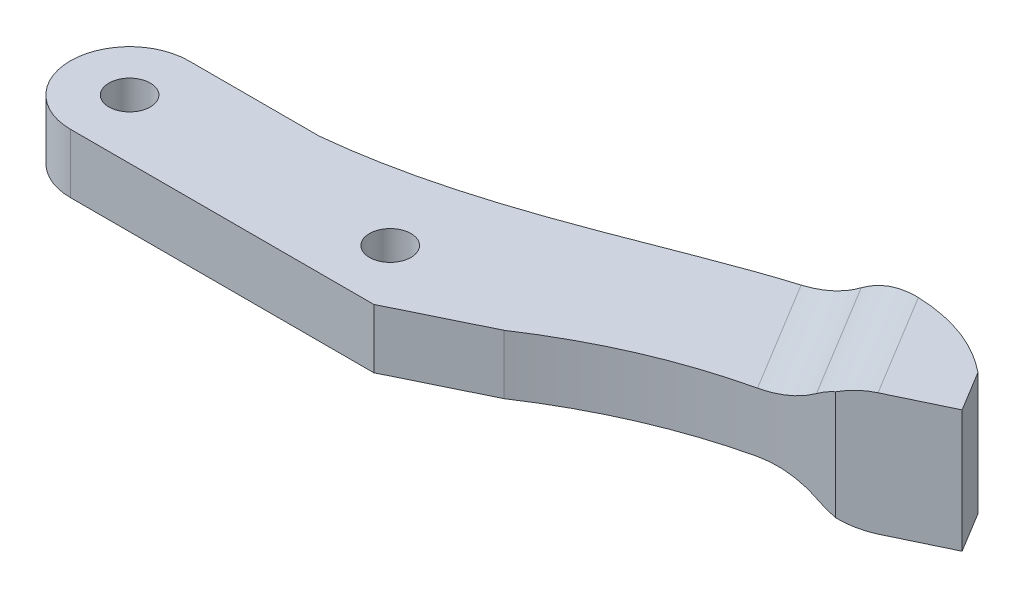
ISO-10303-21;
HEADER;
FILE_DESCRIPTION(('STEP AP214'),'2;1');
FILE_NAME('part.step','',(''),(''),'','','');
FILE_SCHEMA(('AUTOMOTIVE_DESIGN { 1 0 10303 214 1 1 1 1 }'));
ENDSEC;
DATA;
#1=APPLICATION_CONTEXT('core data for automotive mechanical design processes');
#2=APPLICATION_PROTOCOL_DEFINITION('international standard','automotive_design',2000,#1);
#3=PRODUCT_CONTEXT('',#1,'mechanical');
#4=PRODUCT('Part','Part','',(#3));
#5=PRODUCT_RELATED_PRODUCT_CATEGORY('part','',(#4));
#6=PRODUCT_DEFINITION_FORMATION('','',#4);
#7=PRODUCT_DEFINITION_CONTEXT('part definition',#1,'design');
#8=PRODUCT_DEFINITION('design','',#6,#7);
#9=PRODUCT_DEFINITION_SHAPE('','',#8);
#10=(LENGTH_UNIT() NAMED_UNIT(*) SI_UNIT(.MILLI.,.METRE.));
#11=(NAMED_UNIT(*) PLANE_ANGLE_UNIT() SI_UNIT($,.RADIAN.));
#12=(NAMED_UNIT(*) SI_UNIT($,.STERADIAN.) SOLID_ANGLE_UNIT());
#13=UNCERTAINTY_MEASURE_WITH_UNIT(LENGTH_MEASURE(1.E-05),#10,'distance_accuracy_value','');
#14=(GEOMETRIC_REPRESENTATION_CONTEXT(3) GLOBAL_UNCERTAINTY_ASSIGNED_CONTEXT((#13)) GLOBAL_UNIT_ASSIGNED_CONTEXT((#10,
#11,#12)) REPRESENTATION_CONTEXT('',''));
#15=CARTESIAN_POINT('',(0.,0.,0.));
#16=DIRECTION('',(0.,0.,1.));
#17=DIRECTION('',(1.,0.,0.));
#18=AXIS2_PLACEMENT_3D('',#15,#16,#17);
#19=CARTESIAN_POINT('',(-15.6092476783561,6.85945404184539,-4.88622521109503));
#20=DIRECTION('',(0.,0.,-1.));
#21=DIRECTION('',(-1.,0.,0.));
#22=AXIS2_PLACEMENT_3D('',#19,#20,#21);
#23=PLANE('',#22);
#24=DIRECTION('',(1.,0.,0.));
#25=VECTOR('',#24,1.);
#26=CARTESIAN_POINT('',(-15.6092476783561,6.85945404184539,-4.88622521109503));
#27=LINE('',#26,#25);
#28=CARTESIAN_POINT('',(-15.6092476783561,6.85945404184539,-4.88622521109503));
#29=VERTEX_POINT('',#28);
#30=CARTESIAN_POINT('',(0.890752321643914,6.85945404184539,-4.88622521109503));
#31=VERTEX_POINT('',#30);
#32=EDGE_CURVE('E364',#29,#31,#27,.T.);
#33=ORIENTED_EDGE('',*,*,#32,.T.);
#34=DIRECTION('',(0.,1.,0.));
#35=VECTOR('',#34,1.);
#36=CARTESIAN_POINT('',(0.890752321643914,-5.89054595815461,-4.88622521109503));
#37=LINE('',#36,#35);
#38=CARTESIAN_POINT('',(0.890752321643914,-0.640545958154606,-4.88622521109503));
#39=VERTEX_POINT('',#38);
#40=EDGE_CURVE('E390',#39,#31,#37,.T.);
#41=ORIENTED_EDGE('',*,*,#40,.F.);
#42=DIRECTION('',(1.,0.,0.));
#43=VECTOR('',#42,1.);
#44=CARTESIAN_POINT('',(-15.6092476783561,-0.640545958154606,-4.88622521109503));
#45=LINE('',#44,#43);
#46=CARTESIAN_POINT('',(-15.6092476783561,-0.640545958154606,-4.88622521109503));
#47=VERTEX_POINT('',#46);
#48=EDGE_CURVE('E346',#47,#39,#45,.T.);
#49=ORIENTED_EDGE('',*,*,#48,.F.);
#50=DIRECTION('',(0.,-1.,0.));
#51=VECTOR('',#50,1.);
#52=CARTESIAN_POINT('',(-15.6092476783561,6.85945404184539,-4.88622521109503));
#53=LINE('',#52,#51);
#54=EDGE_CURVE('E337',#29,#47,#53,.T.);
#55=ORIENTED_EDGE('',*,*,#54,.F.);
#56=EDGE_LOOP('',(#33,#41,#49,#55));
#57=FACE_BOUND('',#56,.T.);
#58=ADVANCED_FACE('F46',(#57),#23,.T.);
#59=CARTESIAN_POINT('',(-15.6092476783561,6.85945404184539,2.61377478890497));
#60=DIRECTION('',(0.,-1.,0.));
#61=DIRECTION('',(0.,0.,-1.));
#62=AXIS2_PLACEMENT_3D('',#59,#60,#61);
#63=CYLINDRICAL_SURFACE('',#62,7.5);
#64=CARTESIAN_POINT('',(-15.6092476783561,-0.640545958154606,2.61377478890497));
#65=DIRECTION('',(0.,1.,0.));
#66=DIRECTION('',(0.,0.,1.));
#67=AXIS2_PLACEMENT_3D('',#64,#65,#66);
#68=CIRCLE('',#67,7.5);
#69=CARTESIAN_POINT('',(-15.6092476783561,-0.640545958154606,10.113774788905));
#70=VERTEX_POINT('',#69);
#71=EDGE_CURVE('E353',#47,#70,#68,.T.);
#72=ORIENTED_EDGE('',*,*,#71,.T.);
#73=DIRECTION('',(0.,-1.,0.));
#74=VECTOR('',#73,1.);
#75=CARTESIAN_POINT('',(-15.6092476783561,6.85945404184539,10.113774788905));
#76=LINE('',#75,#74);
#77=CARTESIAN_POINT('',(-15.6092476783561,6.85945404184539,10.113774788905));
#78=VERTEX_POINT('',#77);
#79=EDGE_CURVE('E331',#78,#70,#76,.T.);
#80=ORIENTED_EDGE('',*,*,#79,.F.);
#81=CARTESIAN_POINT('',(-15.6092476783561,6.85945404184539,2.61377478890497));
#82=DIRECTION('',(0.,1.,0.));
#83=DIRECTION('',(0.,0.,1.));
#84=AXIS2_PLACEMENT_3D('',#81,#82,#83);
#85=CIRCLE('',#84,7.5);
#86=EDGE_CURVE('E372',#29,#78,#85,.T.);
#87=ORIENTED_EDGE('',*,*,#86,.F.);
#88=ORIENTED_EDGE('',*,*,#54,.T.);
#89=EDGE_LOOP('',(#72,#80,#87,#88));
#90=FACE_BOUND('',#89,.T.);
#91=ADVANCED_FACE('F452',(#90),#63,.T.);
#92=CARTESIAN_POINT('',(-15.6092476783561,6.85945404184539,10.113774788905));
#93=DIRECTION('',(0.,0.,-1.));
#94=DIRECTION('',(-1.,0.,0.));
#95=AXIS2_PLACEMENT_3D('',#92,#93,#94);
#96=PLANE('',#95);
#97=DIRECTION('',(1.,0.,0.));
#98=VECTOR('',#97,1.);
#99=CARTESIAN_POINT('',(-15.6092476783561,-0.640545958154606,10.113774788905));
#100=LINE('',#99,#98);
#101=CARTESIAN_POINT('',(22.8078104755404,-0.640545958154606,10.113774788905));
#102=VERTEX_POINT('',#101);
#103=EDGE_CURVE('E350',#70,#102,#100,.T.);
#104=ORIENTED_EDGE('',*,*,#103,.T.);
#105=DIRECTION('',(0.,1.,0.));
#106=VECTOR('',#105,1.);
#107=CARTESIAN_POINT('',(22.8078104755404,-5.89054595815461,10.113774788905));
#108=LINE('',#107,#106);
#109=CARTESIAN_POINT('',(22.8078104755404,6.85945404184539,10.113774788905));
#110=VERTEX_POINT('',#109);
#111=EDGE_CURVE('E387',#102,#110,#108,.T.);
#112=ORIENTED_EDGE('',*,*,#111,.T.);
#113=DIRECTION('',(1.,0.,0.));
#114=VECTOR('',#113,1.);
#115=CARTESIAN_POINT('',(-15.6092476783561,6.85945404184539,10.113774788905));
#116=LINE('',#115,#114);
#117=EDGE_CURVE('E368',#78,#110,#116,.T.);
#118=ORIENTED_EDGE('',*,*,#117,.F.);
#119=ORIENTED_EDGE('',*,*,#79,.T.);
#120=EDGE_LOOP('',(#104,#112,#118,#119));
#121=FACE_BOUND('',#120,.T.);
#122=ADVANCED_FACE('F454',(#121),#96,.F.);
#123=CARTESIAN_POINT('',(-15.6092476783561,6.85945404184539,2.61377478890497));
#124=DIRECTION('',(0.,-1.,0.));
#125=DIRECTION('',(0.,0.,-1.));
#126=AXIS2_PLACEMENT_3D('',#123,#124,#125);
#127=CYLINDRICAL_SURFACE('',#126,2.625);
#128=CARTESIAN_POINT('',(-15.6092476783561,6.85945404184539,2.61377478890497));
#129=DIRECTION('',(0.,1.,0.));
#130=DIRECTION('',(0.,0.,1.));
#131=AXIS2_PLACEMENT_3D('',#128,#129,#130);
#132=CIRCLE('',#131,2.625);
#133=CARTESIAN_POINT('',(-15.6092476783561,6.85945404184539,5.23877478890497));
#134=VERTEX_POINT('',#133);
#135=EDGE_CURVE('E345',#134,#134,#132,.T.);
#136=ORIENTED_EDGE('',*,*,#135,.T.);
#137=EDGE_LOOP('',(#136));
#138=FACE_BOUND('',#137,.T.);
#139=CARTESIAN_POINT('',(-15.6092476783561,-0.640545958154606,2.61377478890497));
#140=DIRECTION('',(0.,1.,0.));
#141=DIRECTION('',(0.,0.,1.));
#142=AXIS2_PLACEMENT_3D('',#139,#140,#141);
#143=CIRCLE('',#142,2.625);
#144=CARTESIAN_POINT('',(-15.6092476783561,-0.640545958154606,5.23877478890497));
#145=VERTEX_POINT('',#144);
#146=EDGE_CURVE('E357',#145,#145,#143,.T.);
#147=ORIENTED_EDGE('',*,*,#146,.F.);
#148=EDGE_LOOP('',(#147));
#149=FACE_BOUND('',#148,.T.);
#150=ADVANCED_FACE('F475',(#138,#149),#127,.F.);
#151=CARTESIAN_POINT('',(17.3907523216439,6.85945404184539,2.61377478890497));
#152=DIRECTION('',(0.,-1.,0.));
#153=DIRECTION('',(0.,0.,-1.));
#154=AXIS2_PLACEMENT_3D('',#151,#152,#153);
#155=CYLINDRICAL_SURFACE('',#154,2.625);
#156=CARTESIAN_POINT('',(17.3907523216439,6.85945404184539,2.61377478890497));
#157=DIRECTION('',(0.,1.,0.));
#158=DIRECTION('',(0.,0.,1.));
#159=AXIS2_PLACEMENT_3D('',#156,#157,#158);
#160=CIRCLE('',#159,2.625);
#161=CARTESIAN_POINT('',(17.3907523216439,6.85945404184539,5.23877478890497));
#162=VERTEX_POINT('',#161);
#163=EDGE_CURVE('E340',#162,#162,#160,.T.);
#164=ORIENTED_EDGE('',*,*,#163,.T.);
#165=EDGE_LOOP('',(#164));
#166=FACE_BOUND('',#165,.T.);
#167=CARTESIAN_POINT('',(17.3907523216439,-0.640545958154606,2.61377478890497));
#168=DIRECTION('',(0.,1.,0.));
#169=DIRECTION('',(0.,0.,1.));
#170=AXIS2_PLACEMENT_3D('',#167,#168,#169);
#171=CIRCLE('',#170,2.625);
#172=CARTESIAN_POINT('',(17.3907523216439,-0.640545958154606,5.23877478890497));
#173=VERTEX_POINT('',#172);
#174=EDGE_CURVE('E341',#173,#173,#171,.T.);
#175=ORIENTED_EDGE('',*,*,#174,.F.);
#176=EDGE_LOOP('',(#175));
#177=FACE_BOUND('',#176,.T.);
#178=ADVANCED_FACE('F474',(#166,#177),#155,.F.);
#179=CARTESIAN_POINT('',(-15.6092476783561,6.85945404184539,2.61377478890497));
#180=DIRECTION('',(0.,1.,0.));
#181=DIRECTION('',(0.,0.,1.));
#182=AXIS2_PLACEMENT_3D('',#179,#180,#181);
#183=PLANE('',#182);
#184=CARTESIAN_POINT('',(33.8976980211514,6.85945404184539,4.70487522937981));
#185=CARTESIAN_POINT('',(48.1902594385646,6.85945404184539,-4.74586083448159));
#186=CARTESIAN_POINT('',(64.8043315031304,6.85945404184539,-6.38622521109503));
#187=B_SPLINE_CURVE_WITH_KNOTS('',2,(#184,#185,#186),.UNSPECIFIED.,.F.,.F.,(3,3),(0.,1.),.UNSPECIFIED.);
#188=CARTESIAN_POINT('',(33.8976980211514,6.85945404184539,4.70487522937981));
#189=VERTEX_POINT('',#188);
#190=CARTESIAN_POINT('',(56.2879557101564,6.85945404184539,-4.99745104111176));
#191=VERTEX_POINT('',#190);
#192=EDGE_CURVE('E397',#189,#191,#187,.T.);
#193=ORIENTED_EDGE('',*,*,#192,.T.);
#194=DIRECTION('',(0.519093166687858,0.,0.854717663499457));
#195=VECTOR('',#194,1.);
#196=CARTESIAN_POINT('',(49.1515388299981,6.85945404184539,-16.747984382653));
#197=LINE('',#196,#195);
#198=CARTESIAN_POINT('',(47.7471210416633,6.85945404184539,-19.060441505296));
#199=VERTEX_POINT('',#198);
#200=EDGE_CURVE('E326',#191,#199,#197,.F.);
#201=ORIENTED_EDGE('',*,*,#200,.T.);
#202=CARTESIAN_POINT('',(0.890752321643914,6.85945404184539,-4.88622521109503));
#203=CARTESIAN_POINT('',(32.475599820276,6.85945404184539,-8.07591760368592));
#204=CARTESIAN_POINT('',(55.2295099951436,6.85945404184539,-30.4722261629611));
#205=CARTESIAN_POINT('',(72.5157523216439,6.85945404184539,-16.691225211095));
#206=B_SPLINE_CURVE_WITH_KNOTS('',3,(#202,#203,#204,#205),.UNSPECIFIED.,.F.,.F.,(4,4),(0.,1.),.UNSPECIFIED.);
#207=EDGE_CURVE('E206',#31,#199,#206,.T.);
#208=ORIENTED_EDGE('',*,*,#207,.F.);
#209=ORIENTED_EDGE('',*,*,#32,.F.);
#210=ORIENTED_EDGE('',*,*,#86,.T.);
#211=ORIENTED_EDGE('',*,*,#117,.T.);
#212=DIRECTION('',(0.898794046299166,0.,-0.438371146789079));
#213=VECTOR('',#212,1.);
#214=CARTESIAN_POINT('',(22.8078104755404,6.85945404184539,10.113774788905));
#215=LINE('',#214,#213);
#216=EDGE_CURVE('E393',#110,#189,#215,.T.);
#217=ORIENTED_EDGE('',*,*,#216,.T.);
#218=EDGE_LOOP('',(#193,#201,#208,#209,#210,#211,#217));
#219=FACE_BOUND('',#218,.T.);
#220=ORIENTED_EDGE('',*,*,#135,.F.);
#221=EDGE_LOOP('',(#220));
#222=FACE_BOUND('',#221,.T.);
#223=ORIENTED_EDGE('',*,*,#163,.F.);
#224=EDGE_LOOP('',(#223));
#225=FACE_BOUND('',#224,.T.);
#226=ADVANCED_FACE('F229',(#219,#222,#225),#183,.T.);
#227=CARTESIAN_POINT('',(-15.6092476783561,-0.640545958154606,2.61377478890497));
#228=DIRECTION('',(0.,1.,0.));
#229=DIRECTION('',(0.,0.,1.));
#230=AXIS2_PLACEMENT_3D('',#227,#228,#229);
#231=PLANE('',#230);
#232=ORIENTED_EDGE('',*,*,#146,.T.);
#233=EDGE_LOOP('',(#232));
#234=FACE_BOUND('',#233,.T.);
#235=CARTESIAN_POINT('',(0.890752321643914,-0.640545958154606,-4.88622521109503));
#236=CARTESIAN_POINT('',(32.475599820276,-0.640545958154606,-8.07591760368592));
#237=CARTESIAN_POINT('',(55.2295099951436,-0.640545958154606,-30.4722261629611));
#238=CARTESIAN_POINT('',(72.5157523216439,-0.640545958154606,-16.691225211095));
#239=B_SPLINE_CURVE_WITH_KNOTS('',3,(#235,#236,#237,#238),.UNSPECIFIED.,.F.,.F.,(4,4),(0.,1.),.UNSPECIFIED.);
#240=CARTESIAN_POINT('',(47.7471210416633,-0.640545958154606,-19.060441505296));
#241=VERTEX_POINT('',#240);
#242=EDGE_CURVE('E198',#241,#39,#239,.F.);
#243=ORIENTED_EDGE('',*,*,#242,.F.);
#244=DIRECTION('',(0.519093166687858,0.,0.854717663499457));
#245=VECTOR('',#244,1.);
#246=CARTESIAN_POINT('',(40.291633724597,-0.640545958154606,-31.3363432293589));
#247=LINE('',#246,#245);
#248=CARTESIAN_POINT('',(56.2879557101564,-0.640545958154606,-4.99745104111176));
#249=VERTEX_POINT('',#248);
#250=EDGE_CURVE('E320',#241,#249,#247,.T.);
#251=ORIENTED_EDGE('',*,*,#250,.T.);
#252=CARTESIAN_POINT('',(33.8976980211514,-0.640545958154606,4.70487522937981));
#253=CARTESIAN_POINT('',(48.1902594385646,-0.640545958154606,-4.74586083448159));
#254=CARTESIAN_POINT('',(64.8043315031304,-0.640545958154606,-6.38622521109503));
#255=B_SPLINE_CURVE_WITH_KNOTS('',2,(#252,#253,#254),.UNSPECIFIED.,.F.,.F.,(3,3),(0.,1.),.UNSPECIFIED.);
#256=CARTESIAN_POINT('',(33.8976980211514,-0.640545958154606,4.70487522937981));
#257=VERTEX_POINT('',#256);
#258=EDGE_CURVE('E193',#249,#257,#255,.F.);
#259=ORIENTED_EDGE('',*,*,#258,.T.);
#260=DIRECTION('',(-0.898794046299166,0.,0.438371146789079));
#261=VECTOR('',#260,1.);
#262=CARTESIAN_POINT('',(22.8078104755404,-0.640545958154606,10.113774788905));
#263=LINE('',#262,#261);
#264=EDGE_CURVE('E186',#257,#102,#263,.T.);
#265=ORIENTED_EDGE('',*,*,#264,.T.);
#266=ORIENTED_EDGE('',*,*,#103,.F.);
#267=ORIENTED_EDGE('',*,*,#71,.F.);
#268=ORIENTED_EDGE('',*,*,#48,.T.);
#269=EDGE_LOOP('',(#243,#251,#259,#265,#266,#267,#268));
#270=FACE_BOUND('',#269,.T.);
#271=ORIENTED_EDGE('',*,*,#174,.T.);
#272=EDGE_LOOP('',(#271));
#273=FACE_BOUND('',#272,.T.);
#274=ADVANCED_FACE('F227',(#234,#270,#273),#231,.F.);
#275=CARTESIAN_POINT('',(0.890752321643914,-5.89054595815461,-4.88622521109503));
#276=CARTESIAN_POINT('',(32.475599820276,-5.89054595815461,-8.07591760368592));
#277=CARTESIAN_POINT('',(55.2295099951436,-5.89054595815461,-30.4722261629611));
#278=CARTESIAN_POINT('',(72.5157523216439,-5.89054595815461,-16.691225211095));
#279=B_SPLINE_CURVE_WITH_KNOTS('',3,(#275,#276,#277,#278),.UNSPECIFIED.,.F.,.F.,(4,4),(0.,1.),.UNSPECIFIED.);
#280=DIRECTION('',(0.,1.,0.));
#281=VECTOR('',#280,1.);
#282=SURFACE_OF_LINEAR_EXTRUSION('',#279,#281);
#283=CARTESIAN_POINT('',(47.7471210416634,6.85945404184539,-19.0604415052958));
#284=CARTESIAN_POINT('',(48.0371943993894,6.8594224443498,-19.1480812611373));
#285=CARTESIAN_POINT('',(48.3277633958075,6.87236682243878,-19.2340028736703));
#286=CARTESIAN_POINT('',(48.907837466125,6.92373728510356,-19.4015446174389));
#287=CARTESIAN_POINT('',(49.1973427106764,6.96215908538105,-19.4831654694024));
#288=CARTESIAN_POINT('',(49.7731269252925,7.06397801701179,-19.6412139822688));
#289=CARTESIAN_POINT('',(50.0594080552906,7.12735726113118,-19.7176453166516));
#290=CARTESIAN_POINT('',(50.6270029059734,7.27842853479303,-19.8646944689471));
#291=CARTESIAN_POINT('',(50.908316587715,7.3661207548519,-19.9353122412992));
#292=CARTESIAN_POINT('',(51.4640387818507,7.56503386865794,-20.0701871891633));
#293=CARTESIAN_POINT('',(51.7384477853249,7.6762530837766,-20.1344448179855));
#294=CARTESIAN_POINT('',(52.2785037830451,7.92134272160825,-20.2562310760468));
#295=CARTESIAN_POINT('',(52.5441506061028,8.05521358655777,-20.3137595738736));
#296=CARTESIAN_POINT('',(53.0646496389282,8.34455852385438,-20.4218460829261));
#297=CARTESIAN_POINT('',(53.3195092223757,8.50001751785785,-20.472408910679));
#298=CARTESIAN_POINT('',(53.8166850430063,8.83152155890196,-20.5665685289825));
#299=CARTESIAN_POINT('',(54.0590041854445,9.00756180678631,-20.6101669379142));
#300=CARTESIAN_POINT('',(54.6047257343061,9.43883096839516,-20.7034342919112));
#301=CARTESIAN_POINT('',(54.9028594916679,9.70137308797288,-20.7505809103046));
#302=CARTESIAN_POINT('',(55.3277402071347,10.1185664914104,-20.8129236176457));
#303=CARTESIAN_POINT('',(55.4656039248873,10.2614749633796,-20.8323031359356));
#304=CARTESIAN_POINT('',(55.7334730760664,10.5548637202745,-20.8684431137027));
#305=CARTESIAN_POINT('',(55.8634762962256,10.7053461161235,-20.8852028376152));
#306=CARTESIAN_POINT('',(55.9892801379938,10.8594540418454,-20.9007297161559));
#307=B_SPLINE_CURVE_WITH_KNOTS('',3,(#283,#284,#285,#286,#287,#288,#289,#290,#291,#292,#293,
#294,#295,#296,#297,#298,#299,#300,#301,#302,#303,#304,#305,#306),.UNSPECIFIED.,.F.,.F.,(4,2,2,
2,2,2,2,2,2,2,2,4),(0.,0.908756588631336,1.81736039896167,2.72531418621905,3.63327508840085,
4.54117123028115,5.44908509939915,6.35636799123257,7.26343974236141,8.46079195109327,
9.05906027464213,9.65749627460022),.UNSPECIFIED.);
#308=CARTESIAN_POINT('',(53.8491360089384,8.8594540418454,-20.5717309517311));
#309=VERTEX_POINT('',#308);
#310=EDGE_CURVE('E234',#199,#309,#307,.T.);
#311=ORIENTED_EDGE('',*,*,#310,.T.);
#312=CARTESIAN_POINT('',(53.8491360089384,8.8594540418454,-20.5717309517311));
#313=CARTESIAN_POINT('',(54.0130431764405,8.97617662169888,-20.6016222325846));
#314=CARTESIAN_POINT('',(54.1805397254148,9.08793550572809,-20.6311499628802));
#315=CARTESIAN_POINT('',(54.521990201322,9.30127939514251,-20.6889984333081));
#316=CARTESIAN_POINT('',(54.6959412855155,9.40286880819982,-20.7173196932668));
#317=CARTESIAN_POINT('',(55.0497002482361,9.5957166833494,-20.7722985924502));
#318=CARTESIAN_POINT('',(55.2295073613347,9.68697648867847,-20.7989564477771));
#319=CARTESIAN_POINT('',(55.5896256032861,9.85684808894357,-20.8494878248171));
#320=CARTESIAN_POINT('',(55.7698039912575,9.93572549732411,-20.8734154450696));
#321=CARTESIAN_POINT('',(56.1344946609361,10.0835460356807,-20.918836140881));
#322=CARTESIAN_POINT('',(56.3190070716016,10.1524888696181,-20.9403291438873));
#323=CARTESIAN_POINT('',(56.6917260127901,10.2804568859217,-20.9804723095781));
#324=CARTESIAN_POINT('',(56.879932287855,10.3394827514392,-20.9991226680761));
#325=CARTESIAN_POINT('',(57.2544075725147,10.4462768103354,-21.0327446706335));
#326=CARTESIAN_POINT('',(57.4405959574484,10.4943016729427,-21.0478006345221));
#327=CARTESIAN_POINT('',(57.8153430682879,10.5811780377564,-21.0745198010039));
#328=CARTESIAN_POINT('',(58.0039018432431,10.6200293498083,-21.0861829332698));
#329=CARTESIAN_POINT('',(58.3828629206399,10.6887504095025,-21.1058087569883));
#330=CARTESIAN_POINT('',(58.5732654740804,10.7186189160299,-21.1137709371795));
#331=CARTESIAN_POINT('',(58.9603253303155,10.7702677067114,-21.1258690414069));
#332=CARTESIAN_POINT('',(59.1570166119061,10.7918176844607,-21.12990017885));
#333=CARTESIAN_POINT('',(59.5511883864907,10.8260070322497,-21.1335026050424));
#334=CARTESIAN_POINT('',(59.7486688043348,10.8386472313502,-21.1330743088035));
#335=CARTESIAN_POINT('',(60.1438434184303,10.8553721369932,-21.1275398980239));
#336=CARTESIAN_POINT('',(60.3415374872961,10.859460496563,-21.1224357821595));
#337=CARTESIAN_POINT('',(60.5391262689209,10.8594540418454,-21.1148842306747));
#338=B_SPLINE_CURVE_WITH_KNOTS('',3,(#312,#313,#314,#315,#316,#317,#318,#319,#320,#321,#322,
#323,#324,#325,#326,#327,#328,#329,#330,#331,#332,#333,#334,#335,#336,#337),.UNSPECIFIED.,.F.,
.F.,(4,2,2,2,2,2,2,2,2,2,2,2,4),(0.,0.610180162333641,1.22009470358541,1.82992984170962,
2.4240280872613,3.01814403258019,3.612219034161,4.19056625797996,4.76892546904923,
5.34736455280452,5.94083234370038,6.53424490473045,7.12740393020789),.UNSPECIFIED.);
#339=CARTESIAN_POINT('',(60.5391262687505,10.8594540418454,-21.1148842306812));
#340=VERTEX_POINT('',#339);
#341=EDGE_CURVE('E259',#309,#340,#338,.T.);
#342=ORIENTED_EDGE('',*,*,#341,.T.);
#343=CARTESIAN_POINT('',(0.890752321643914,10.8594540418454,-4.88622521109503));
#344=CARTESIAN_POINT('',(32.475599820276,10.8594540418454,-8.07591760368592));
#345=CARTESIAN_POINT('',(55.2295099951436,10.8594540418454,-30.4722261629611));
#346=CARTESIAN_POINT('',(72.5157523216439,10.8594540418454,-16.691225211095));
#347=B_SPLINE_CURVE_WITH_KNOTS('',3,(#343,#344,#345,#346),.UNSPECIFIED.,.F.,.F.,(4,4),(0.,1.),.UNSPECIFIED.);
#348=CARTESIAN_POINT('',(72.5157523216439,10.8594540418454,-16.691225211095));
#349=VERTEX_POINT('',#348);
#350=EDGE_CURVE('E178',#340,#349,#347,.T.);
#351=ORIENTED_EDGE('',*,*,#350,.T.);
#352=DIRECTION('',(0.,1.,0.));
#353=VECTOR('',#352,1.);
#354=CARTESIAN_POINT('',(72.5157523216439,-5.89054595815461,-16.691225211095));
#355=LINE('',#354,#353);
#356=CARTESIAN_POINT('',(72.5157523216439,-4.64054595815461,-16.691225211095));
#357=VERTEX_POINT('',#356);
#358=EDGE_CURVE('E169',#357,#349,#355,.T.);
#359=ORIENTED_EDGE('',*,*,#358,.F.);
#360=CARTESIAN_POINT('',(0.890752321643914,-4.64054595815461,-4.88622521109503));
#361=CARTESIAN_POINT('',(32.475599820276,-4.64054595815461,-8.07591760368592));
#362=CARTESIAN_POINT('',(55.2295099951436,-4.64054595815461,-30.4722261629611));
#363=CARTESIAN_POINT('',(72.5157523216439,-4.64054595815461,-16.691225211095));
#364=B_SPLINE_CURVE_WITH_KNOTS('',3,(#360,#361,#362,#363),.UNSPECIFIED.,.F.,.F.,(4,4),(0.,1.),.UNSPECIFIED.);
#365=CARTESIAN_POINT('',(60.5391262687505,-4.64054595815461,-21.1148842306812));
#366=VERTEX_POINT('',#365);
#367=EDGE_CURVE('E173',#357,#366,#364,.F.);
#368=ORIENTED_EDGE('',*,*,#367,.T.);
#369=CARTESIAN_POINT('',(60.5391262688011,-4.64054595815461,-21.1148842320083));
#370=CARTESIAN_POINT('',(60.3249643122523,-4.64055500859455,-21.1230713061163));
#371=CARTESIAN_POINT('',(60.1106762083822,-4.63575062098588,-21.1283803193114));
#372=CARTESIAN_POINT('',(59.6823597387993,-4.61606187074084,-21.1335291754521));
#373=CARTESIAN_POINT('',(59.4683316346004,-4.60117091802805,-21.1333654393833));
#374=CARTESIAN_POINT('',(59.041291732323,-4.56085123287121,-21.1278453024246));
#375=CARTESIAN_POINT('',(58.8282801182711,-4.53542066045555,-21.1224879946396));
#376=CARTESIAN_POINT('',(58.4098502060653,-4.47449781393409,-21.1071456376215));
#377=CARTESIAN_POINT('',(58.2043840939852,-4.43930122422423,-21.0972917978219));
#378=CARTESIAN_POINT('',(57.7958460216499,-4.35831555877115,-21.0733723838929));
#379=CARTESIAN_POINT('',(57.5927734896607,-4.31252906873424,-21.0593078376333));
#380=CARTESIAN_POINT('',(57.1897020889378,-4.21015166035398,-21.0273718879064));
#381=CARTESIAN_POINT('',(56.9897027233788,-4.15356250871437,-21.0095011068682));
#382=CARTESIAN_POINT('',(56.6184206599703,-4.03725486477197,-20.9728521706698));
#383=CARTESIAN_POINT('',(56.4466930557013,-3.9788276374939,-20.9544716127215));
#384=CARTESIAN_POINT('',(56.1065927713001,-3.85356429138984,-20.9154440248022));
#385=CARTESIAN_POINT('',(55.9382200452474,-3.78672828775224,-20.8947970258786));
#386=CARTESIAN_POINT('',(55.605324562836,-3.64465156969258,-20.8515587770335));
#387=CARTESIAN_POINT('',(55.4408015904781,-3.56941132818348,-20.8289676365268));
#388=CARTESIAN_POINT('',(55.1120929367485,-3.40862106446028,-20.7815955305169));
#389=CARTESIAN_POINT('',(54.9480144804224,-3.32286345285921,-20.7567744480359));
#390=CARTESIAN_POINT('',(54.624885817196,-3.14265783742545,-20.7057933989855));
#391=CARTESIAN_POINT('',(54.4658362511173,-3.04820873200141,-20.6796332628865));
#392=CARTESIAN_POINT('',(54.1532261276279,-2.85075171013627,-20.6263282100071));
#393=CARTESIAN_POINT('',(53.999667711589,-2.74774050570467,-20.5991829171853));
#394=CARTESIAN_POINT('',(53.8491360089374,-2.64054595815391,-20.5717309517309));
#395=B_SPLINE_CURVE_WITH_KNOTS('',3,(#369,#370,#371,#372,#373,#374,#375,#376,#377,#378,#379,
#380,#381,#382,#383,#384,#385,#386,#387,#388,#389,#390,#391,#392,#393,#394),.UNSPECIFIED.,.F.,
.F.,(4,2,2,2,2,2,2,2,2,2,2,2,4),(0.,0.642905837385105,1.28623212418991,1.92967076808935,
2.55542856442451,3.18103373222831,3.80653667396975,4.35327810083584,4.90001203892972,
5.44671522736676,6.00682607912351,6.56700801938737,7.12740608175013),.UNSPECIFIED.);
#396=CARTESIAN_POINT('',(53.8491360089377,-2.64054595815415,-20.5717309517309));
#397=VERTEX_POINT('',#396);
#398=EDGE_CURVE('E63',#366,#397,#395,.T.);
#399=ORIENTED_EDGE('',*,*,#398,.T.);
#400=CARTESIAN_POINT('',(55.9892801409363,-4.64054595815461,-20.9007297165191));
#401=CARTESIAN_POINT('',(55.8611452002714,-4.48357289062586,-20.8849181648925));
#402=CARTESIAN_POINT('',(55.728614151302,-4.3303305359298,-20.8678178948356));
#403=CARTESIAN_POINT('',(55.4553940479511,-4.0317048847866,-20.8308936964505));
#404=CARTESIAN_POINT('',(55.3147067747766,-3.8863198857018,-20.8110703615168));
#405=CARTESIAN_POINT('',(55.0257589228147,-3.60374457804923,-20.7685480588524));
#406=CARTESIAN_POINT('',(54.8774986992888,-3.46655388572475,-20.745849225943));
#407=CARTESIAN_POINT('',(54.5739746300408,-3.20069417886588,-20.6974604385396));
#408=CARTESIAN_POINT('',(54.4187102972627,-3.07202575849879,-20.6717702758357));
#409=CARTESIAN_POINT('',(54.1017538676516,-2.82354779673747,-20.6173148944448));
#410=CARTESIAN_POINT('',(53.9400615674606,-2.70373853595894,-20.5885495784221));
#411=CARTESIAN_POINT('',(53.6108337390702,-2.47331303926628,-20.527898832561));
#412=CARTESIAN_POINT('',(53.4432982224536,-2.36269678513055,-20.4960134089074));
#413=CARTESIAN_POINT('',(53.0178500426951,-2.09803943904036,-20.4123756443523));
#414=CARTESIAN_POINT('',(52.7566073348118,-1.9499179119389,-20.358657252647));
#415=CARTESIAN_POINT('',(52.2240944109304,-1.67606028888904,-20.2442494859993));
#416=CARTESIAN_POINT('',(51.9528229014902,-1.55032709267423,-20.1835592097317));
#417=CARTESIAN_POINT('',(51.4024547897258,-1.32232500994343,-20.0555556765315));
#418=CARTESIAN_POINT('',(51.123367304186,-1.22002996704063,-19.9882499234033));
#419=CARTESIAN_POINT('',(50.5591338983755,-1.03961382426833,-19.847445372798));
#420=CARTESIAN_POINT('',(50.2739895593388,-0.961486495961287,-19.7739481771854));
#421=CARTESIAN_POINT('',(49.6174153316548,-0.811361493174312,-19.5995370131581));
#422=CARTESIAN_POINT('',(49.2445673587627,-0.747464930704935,-19.496781438257));
#423=CARTESIAN_POINT('',(48.6836206580886,-0.68341406754158,-19.3370349307723));
#424=CARTESIAN_POINT('',(48.4963909911682,-0.667362804377043,-19.2828601720918));
#425=CARTESIAN_POINT('',(48.1217595661679,-0.645928165437997,-19.1728430771846));
#426=CARTESIAN_POINT('',(47.9343577764538,-0.64054750065901,-19.1170003208396));
#427=CARTESIAN_POINT('',(47.7471210416633,-0.640545958154607,-19.060441505296));
#428=B_SPLINE_CURVE_WITH_KNOTS('',3,(#400,#401,#402,#403,#404,#405,#406,#407,#408,#409,#410,
#411,#412,#413,#414,#415,#416,#417,#418,#419,#420,#421,#422,#423,#424,#425,#426,#427),
.UNSPECIFIED.,.F.,.F.,(4,2,2,2,2,2,2,2,2,2,2,2,2,4),(0.,0.609639802798663,1.21914696655259,
1.82862556338082,2.43814660803138,3.04768695112219,3.65722608600499,4.57133437919467,
5.48556098158457,6.3987623062106,7.3117280866269,8.48503807933758,9.07149546663646,
9.65810183150113),.UNSPECIFIED.);
#429=EDGE_CURVE('E245',#397,#241,#428,.T.);
#430=ORIENTED_EDGE('',*,*,#429,.T.);
#431=ORIENTED_EDGE('',*,*,#242,.T.);
#432=ORIENTED_EDGE('',*,*,#40,.T.);
#433=ORIENTED_EDGE('',*,*,#207,.T.);
#434=EDGE_LOOP('',(#311,#342,#351,#359,#368,#399,#430,#431,#432,#433));
#435=FACE_BOUND('',#434,.T.);
#436=ADVANCED_FACE('F222',(#435),#282,.F.);
#437=CARTESIAN_POINT('',(72.5157523216439,-5.89054595815461,-16.691225211095));
#438=DIRECTION('',(-0.854717663499457,0.,0.519093166687858));
#439=DIRECTION('',(0.519093166687858,0.,0.854717663499457));
#440=AXIS2_PLACEMENT_3D('',#437,#438,#439);
#441=PLANE('',#440);
#442=DIRECTION('',(0.,1.,0.));
#443=VECTOR('',#442,1.);
#444=CARTESIAN_POINT('',(75.6303113217711,-5.89054595815461,-11.5629192300983));
#445=LINE('',#444,#443);
#446=CARTESIAN_POINT('',(75.6303113217711,-4.64054595815461,-11.5629192300983));
#447=VERTEX_POINT('',#446);
#448=CARTESIAN_POINT('',(75.6303113217711,10.8594540418454,-11.5629192300983));
#449=VERTEX_POINT('',#448);
#450=EDGE_CURVE('E151',#447,#449,#445,.T.);
#451=ORIENTED_EDGE('',*,*,#450,.F.);
#452=DIRECTION('',(0.519093166687858,0.,0.854717663499457));
#453=VECTOR('',#452,1.);
#454=CARTESIAN_POINT('',(43.6909809724656,-4.64054595815461,-64.1529195648767));
#455=LINE('',#454,#453);
#456=EDGE_CURVE('E164',#357,#447,#455,.T.);
#457=ORIENTED_EDGE('',*,*,#456,.F.);
#458=ORIENTED_EDGE('',*,*,#358,.T.);
#459=DIRECTION('',(0.519093166687858,0.,0.854717663499457));
#460=VECTOR('',#459,1.);
#461=CARTESIAN_POINT('',(43.6909809724656,10.8594540418454,-64.1529195648767));
#462=LINE('',#461,#460);
#463=EDGE_CURVE('E166',#349,#449,#462,.T.);
#464=ORIENTED_EDGE('',*,*,#463,.T.);
#465=EDGE_LOOP('',(#451,#457,#458,#464));
#466=FACE_BOUND('',#465,.T.);
#467=ADVANCED_FACE('F162',(#466),#441,.F.);
#468=CARTESIAN_POINT('',(75.6303113217711,-5.89054595815461,-11.5629192300983));
#469=DIRECTION('',(-0.431391168250272,0.,-0.902164984886726));
#470=DIRECTION('',(-0.902164984886726,0.,0.431391168250272));
#471=AXIS2_PLACEMENT_3D('',#468,#469,#470);
#472=PLANE('',#471);
#473=DIRECTION('',(-0.902164984886726,0.,0.431391168250272));
#474=VECTOR('',#473,1.);
#475=CARTESIAN_POINT('',(64.8043315031304,10.8594540418454,-6.38622521109503));
#476=LINE('',#475,#474);
#477=CARTESIAN_POINT('',(68.4310213295722,10.8594540418454,-8.12041129381751));
#478=VERTEX_POINT('',#477);
#479=EDGE_CURVE('E158',#449,#478,#476,.T.);
#480=ORIENTED_EDGE('',*,*,#479,.T.);
#481=CARTESIAN_POINT('',(68.4310213295722,0.859454041845401,-8.12041129381752));
#482=DIRECTION('',(-0.431391168250272,0.,-0.902164984886726));
#483=DIRECTION('',(-0.902164984886726,0.,0.431391168250272));
#484=AXIS2_PLACEMENT_3D('',#481,#482,#483);
#485=ELLIPSE('',#484,10.0499628316243,10.);
#486=CARTESIAN_POINT('',(64.8043315031304,10.0246054317571,-6.38622521109503));
#487=VERTEX_POINT('',#486);
#488=EDGE_CURVE('E422',#478,#487,#485,.F.);
#489=ORIENTED_EDGE('',*,*,#488,.T.);
#490=DIRECTION('',(0.,1.,0.));
#491=VECTOR('',#490,1.);
#492=CARTESIAN_POINT('',(64.8043315031304,-5.89054595815461,-6.38622521109503));
#493=LINE('',#492,#491);
#494=CARTESIAN_POINT('',(64.8043315031304,-3.80569734806629,-6.38622521109503));
#495=VERTEX_POINT('',#494);
#496=EDGE_CURVE('E170',#495,#487,#493,.T.);
#497=ORIENTED_EDGE('',*,*,#496,.F.);
#498=CARTESIAN_POINT('',(68.4310213295722,5.35945404184539,-8.12041129381751));
#499=DIRECTION('',(-0.431391168250272,0.,-0.902164984886726));
#500=DIRECTION('',(0.902164984886726,0.,-0.431391168250272));
#501=AXIS2_PLACEMENT_3D('',#498,#499,#500);
#502=ELLIPSE('',#501,10.0499628316243,10.);
#503=CARTESIAN_POINT('',(68.4310213295722,-4.64054595815461,-8.12041129381751));
#504=VERTEX_POINT('',#503);
#505=EDGE_CURVE('E155',#495,#504,#502,.F.);
#506=ORIENTED_EDGE('',*,*,#505,.T.);
#507=DIRECTION('',(0.902164984886726,0.,-0.431391168250272));
#508=VECTOR('',#507,1.);
#509=CARTESIAN_POINT('',(64.8043315031304,-4.64054595815461,-6.38622521109503));
#510=LINE('',#509,#508);
#511=EDGE_CURVE('E147',#504,#447,#510,.T.);
#512=ORIENTED_EDGE('',*,*,#511,.T.);
#513=ORIENTED_EDGE('',*,*,#450,.T.);
#514=EDGE_LOOP('',(#480,#489,#497,#506,#512,#513));
#515=FACE_BOUND('',#514,.T.);
#516=ADVANCED_FACE('F150',(#515),#472,.F.);
#517=CARTESIAN_POINT('',(33.8976980211514,-5.89054595815461,4.70487522937981));
#518=CARTESIAN_POINT('',(48.1902594385646,-5.89054595815461,-4.74586083448159));
#519=CARTESIAN_POINT('',(64.8043315031304,-5.89054595815461,-6.38622521109503));
#520=B_SPLINE_CURVE_WITH_KNOTS('',2,(#517,#518,#519),.UNSPECIFIED.,.F.,.F.,(3,3),(0.,1.),.UNSPECIFIED.);
#521=DIRECTION('',(0.,1.,0.));
#522=VECTOR('',#521,1.);
#523=SURFACE_OF_LINEAR_EXTRUSION('',#520,#522);
#524=ORIENTED_EDGE('',*,*,#496,.T.);
#525=CARTESIAN_POINT('',(64.8043315031304,10.0246054317571,-6.38622521109503));
#526=CARTESIAN_POINT('',(64.7077327519587,9.98641097154163,-6.37668792340925));
#527=CARTESIAN_POINT('',(64.6116725076739,9.94689012804549,-6.36699949605183));
#528=CARTESIAN_POINT('',(64.420942506303,9.86529921411304,-6.34736614903229));
#529=CARTESIAN_POINT('',(64.326269966132,9.82323548717095,-6.33742190050367));
#530=CARTESIAN_POINT('',(64.1383175448227,9.73654957934979,-6.31729310772644));
#531=CARTESIAN_POINT('',(64.0450356485665,9.69193167210572,-6.30710898073054));
#532=CARTESIAN_POINT('',(63.8598695234439,9.60012310041922,-6.28651720449063));
#533=CARTESIAN_POINT('',(63.7679841912222,9.55293461819769,-6.27610974924817));
#534=CARTESIAN_POINT('',(63.5856116606523,9.4559605099846,-6.25508741268681));
#535=CARTESIAN_POINT('',(63.4951245391178,9.40617474195812,-6.2444725200439));
#536=CARTESIAN_POINT('',(63.3155681712106,9.30398375064542,-6.22305362261353));
#537=CARTESIAN_POINT('',(63.2265001061205,9.25157648143097,-6.21224947453477));
#538=CARTESIAN_POINT('',(63.0497985824817,9.14411092835993,-6.19047009317856));
#539=CARTESIAN_POINT('',(62.9621676853683,9.08904848218213,-6.1794946108115));
#540=CARTESIAN_POINT('',(62.7883608510074,8.97623571610679,-6.15739146022482));
#541=CARTESIAN_POINT('',(62.7021890568723,8.91847907424668,-6.1462634823028));
#542=CARTESIAN_POINT('',(62.6169002896298,8.85945404184546,-6.13508743372308));
#543=B_SPLINE_CURVE_WITH_KNOTS('',3,(#525,#526,#527,#528,#529,#530,#531,#532,#533,#534,#535,
#536,#537,#538,#539,#540,#541,#542),.UNSPECIFIED.,.F.,.F.,(4,2,2,2,2,2,2,2,4),(0.,
0.312928705439943,0.625106643684877,0.936776705217978,1.24818618555035,1.55961271348156,
1.87128620362298,2.18346525993655,2.49641783410495),.UNSPECIFIED.);
#544=CARTESIAN_POINT('',(62.6169002896298,8.85945404184544,-6.13508743372308));
#545=VERTEX_POINT('',#544);
#546=EDGE_CURVE('E274',#487,#545,#543,.T.);
#547=ORIENTED_EDGE('',*,*,#546,.T.);
#548=CARTESIAN_POINT('',(64.8043315031304,10.8594540418454,-6.38622521109503));
#549=CARTESIAN_POINT('',(64.6073822825126,10.6215266085048,-6.36678478801338));
#550=CARTESIAN_POINT('',(64.3999614091947,10.3925137616059,-6.34545379505627));
#551=CARTESIAN_POINT('',(63.966464997754,9.95350752603965,-6.29871338493627));
#552=CARTESIAN_POINT('',(63.7403971567752,9.74350636402288,-6.27330564652955));
#553=CARTESIAN_POINT('',(63.271939711223,9.34369547012791,-6.2181236921106));
#554=CARTESIAN_POINT('',(63.0295648911746,9.15386784051389,-6.18835340325065));
#555=CARTESIAN_POINT('',(62.5303913781811,8.79508261921288,-6.12416145626226));
#556=CARTESIAN_POINT('',(62.2735914395265,8.62612683399816,-6.08973939605899));
#557=CARTESIAN_POINT('',(61.7479404307057,8.31012478075439,-6.01606944643342));
#558=CARTESIAN_POINT('',(61.47910416491,8.16305251006351,-5.97682738719717));
#559=CARTESIAN_POINT('',(60.9310767833788,7.89133642271787,-5.89332444465785));
#560=CARTESIAN_POINT('',(60.6518854878463,7.76669299572073,-5.84906347418272));
#561=CARTESIAN_POINT('',(60.0852646653969,7.5406220741309,-5.75545816025435));
#562=CARTESIAN_POINT('',(59.797840041278,7.4391810735042,-5.70611679845849));
#563=CARTESIAN_POINT('',(59.2166734056471,7.26012741266223,-5.60234933236572));
#564=CARTESIAN_POINT('',(58.9229328765692,7.18250922482883,-5.54792441143789));
#565=CARTESIAN_POINT('',(58.2414080646148,7.03191807614413,-5.41682164513318));
#566=CARTESIAN_POINT('',(57.8520273798176,6.96743602131538,-5.33838903453767));
#567=CARTESIAN_POINT('',(57.2660929475469,6.90276780851528,-5.21482334476713));
#568=CARTESIAN_POINT('',(57.0705417731104,6.88655429126789,-5.17266492453667));
#569=CARTESIAN_POINT('',(56.6792605989981,6.86489873916692,-5.0864556026308));
#570=CARTESIAN_POINT('',(56.4835305989702,6.85945672555993,-5.04240469722266));
#571=CARTESIAN_POINT('',(56.2879557100491,6.8594540418454,-4.99745104108708));
#572=B_SPLINE_CURVE_WITH_KNOTS('',3,(#548,#549,#550,#551,#552,#553,#554,#555,#556,#557,#558,
#559,#560,#561,#562,#563,#564,#565,#566,#567,#568,#569,#570,#571),.UNSPECIFIED.,.F.,.F.,(4,2,2,
2,2,2,2,2,2,2,2,4),(0.,0.928021797472309,1.85566242255423,2.7824730610398,3.7093638594965,
4.63514434853685,5.5609409196626,6.48619720923095,7.41123864857484,8.61580338558641,
9.21765173940292,9.81950128035265),.UNSPECIFIED.);
#573=EDGE_CURVE('E297',#545,#191,#572,.T.);
#574=ORIENTED_EDGE('',*,*,#573,.T.);
#575=ORIENTED_EDGE('',*,*,#192,.F.);
#576=DIRECTION('',(0.,1.,0.));
#577=VECTOR('',#576,1.);
#578=CARTESIAN_POINT('',(33.8976980211514,-5.89054595815461,4.70487522937981));
#579=LINE('',#578,#577);
#580=EDGE_CURVE('E384',#257,#189,#579,.T.);
#581=ORIENTED_EDGE('',*,*,#580,.F.);
#582=ORIENTED_EDGE('',*,*,#258,.F.);
#583=CARTESIAN_POINT('',(56.287955709469,-0.640545958154606,-4.99745104410249));
#584=CARTESIAN_POINT('',(56.5958344920932,-0.640525528333429,-5.06823852777157));
#585=CARTESIAN_POINT('',(56.9041935230878,-0.654034761799578,-5.13677575040664));
#586=CARTESIAN_POINT('',(57.519587964014,-0.707562933664897,-5.26900889738133));
#587=CARTESIAN_POINT('',(57.8266236210766,-0.747576685625698,-5.33270576616987));
#588=CARTESIAN_POINT('',(58.4374751892477,-0.853610829808775,-5.45499859350735));
#589=CARTESIAN_POINT('',(58.7412880644265,-0.919653833795287,-5.5135900627822));
#590=CARTESIAN_POINT('',(59.343275540368,-1.07709063736635,-5.6254535077773));
#591=CARTESIAN_POINT('',(59.6414500102574,-1.16848502461286,-5.67872536014635));
#592=CARTESIAN_POINT('',(60.2299834131842,-1.3759001250655,-5.77988826686788));
#593=CARTESIAN_POINT('',(60.5203437100129,-1.4919165092236,-5.82778026484747));
#594=CARTESIAN_POINT('',(61.0911998788795,-1.74783117224269,-5.91824717212232));
#595=CARTESIAN_POINT('',(61.3716957956459,-1.88772934279822,-5.96082210552928));
#596=CARTESIAN_POINT('',(61.9203080305854,-2.19039272771214,-6.04073412781323));
#597=CARTESIAN_POINT('',(62.1884420764028,-2.3531237516173,-6.07807888440117));
#598=CARTESIAN_POINT('',(62.7105304443947,-2.70068736585922,-6.14780165418806));
#599=CARTESIAN_POINT('',(62.9644891555006,-2.88551305899224,-6.18018121018603));
#600=CARTESIAN_POINT('',(63.5014062019511,-3.31240782717977,-6.24578109901585));
#601=CARTESIAN_POINT('',(63.7811030089935,-3.55875232058407,-6.27805998995224));
#602=CARTESIAN_POINT('',(64.313724078935,-4.07925448339552,-6.3365540365308));
#603=CARTESIAN_POINT('',(64.5666599453863,-4.35339999644664,-6.36277182616081));
#604=CARTESIAN_POINT('',(64.8043315031304,-4.64054595815461,-6.38622521109503));
#605=B_SPLINE_CURVE_WITH_KNOTS('',3,(#583,#584,#585,#586,#587,#588,#589,#590,#591,#592,#593,
#594,#595,#596,#597,#598,#599,#600,#601,#602,#603,#604),.UNSPECIFIED.,.F.,.F.,(4,2,2,2,2,2,2,2,
2,2,4),(0.,0.947386325954552,1.89458732087562,2.84261297496349,3.79066060675422,
4.73854169036845,5.68641847539447,6.63289074183577,7.57906831961482,8.69933424890228,
9.81911242244285),.UNSPECIFIED.);
#606=CARTESIAN_POINT('',(62.6169002896297,-2.64054595815461,-6.13508743372307));
#607=VERTEX_POINT('',#606);
#608=EDGE_CURVE('E304',#249,#607,#605,.T.);
#609=ORIENTED_EDGE('',*,*,#608,.T.);
#610=CARTESIAN_POINT('',(62.6169002896297,-2.64054595815461,-6.13508743372307));
#611=CARTESIAN_POINT('',(62.7021890568722,-2.69957099055584,-6.14626348230279));
#612=CARTESIAN_POINT('',(62.7883608510073,-2.75732763241595,-6.15739146022481));
#613=CARTESIAN_POINT('',(62.9621676853682,-2.8701403984913,-6.1794946108115));
#614=CARTESIAN_POINT('',(63.0497985824816,-2.92520284466911,-6.19047009317855));
#615=CARTESIAN_POINT('',(63.2265001061204,-3.03266839774016,-6.21224947453477));
#616=CARTESIAN_POINT('',(63.3155681712106,-3.08507566695461,-6.22305362261352));
#617=CARTESIAN_POINT('',(63.4951245391178,-3.18726665826732,-6.24447252004389));
#618=CARTESIAN_POINT('',(63.5856116606522,-3.23705242629381,-6.25508741268681));
#619=CARTESIAN_POINT('',(63.7679841912222,-3.33402653450689,-6.27610974924817));
#620=CARTESIAN_POINT('',(63.8598695234439,-3.38121501672842,-6.28651720449062));
#621=CARTESIAN_POINT('',(64.0450356485665,-3.47302358841492,-6.30710898073054));
#622=CARTESIAN_POINT('',(64.1383175448227,-3.517641495659,-6.31729310772644));
#623=CARTESIAN_POINT('',(64.326269966132,-3.60432740348016,-6.33742190050367));
#624=CARTESIAN_POINT('',(64.420942506303,-3.64639113042225,-6.34736614903229));
#625=CARTESIAN_POINT('',(64.6116725076739,-3.7279820443547,-6.36699949605182));
#626=CARTESIAN_POINT('',(64.7077327519587,-3.76750288785084,-6.37668792340925));
#627=CARTESIAN_POINT('',(64.8043315031304,-3.80569734806629,-6.38622521109503));
#628=B_SPLINE_CURVE_WITH_KNOTS('',3,(#610,#611,#612,#613,#614,#615,#616,#617,#618,#619,#620,
#621,#622,#623,#624,#625,#626,#627),.UNSPECIFIED.,.F.,.F.,(4,2,2,2,2,2,2,2,4),(0.,
0.312952574168438,0.625131630482007,0.936805120623447,1.24823164855466,1.55964112888706,
1.87131119042015,2.18348912866511,2.49641783410506),.UNSPECIFIED.);
#629=EDGE_CURVE('E282',#607,#495,#628,.T.);
#630=ORIENTED_EDGE('',*,*,#629,.T.);
#631=EDGE_LOOP('',(#524,#547,#574,#575,#581,#582,#609,#630));
#632=FACE_BOUND('',#631,.T.);
#633=ADVANCED_FACE('F288',(#632),#523,.T.);
#634=CARTESIAN_POINT('',(22.8078104755404,-5.89054595815461,10.113774788905));
#635=DIRECTION('',(0.438371146789079,0.,0.898794046299166));
#636=DIRECTION('',(0.898794046299166,0.,-0.438371146789079));
#637=AXIS2_PLACEMENT_3D('',#634,#635,#636);
#638=PLANE('',#637);
#639=ORIENTED_EDGE('',*,*,#264,.F.);
#640=ORIENTED_EDGE('',*,*,#580,.T.);
#641=ORIENTED_EDGE('',*,*,#216,.F.);
#642=ORIENTED_EDGE('',*,*,#111,.F.);
#643=EDGE_LOOP('',(#639,#640,#641,#642));
#644=FACE_BOUND('',#643,.T.);
#645=ADVANCED_FACE('F292',(#644),#638,.T.);
#646=CARTESIAN_POINT('',(32.8650011538249,-4.64054595815461,-58.9762255458734));
#647=DIRECTION('',(0.,-1.,0.));
#648=DIRECTION('',(1.,0.,0.));
#649=AXIS2_PLACEMENT_3D('',#646,#647,#648);
#650=PLANE('',#649);
#651=ORIENTED_EDGE('',*,*,#511,.F.);
#652=DIRECTION('',(-0.519093166687858,0.,-0.854717663499457));
#653=VECTOR('',#652,1.);
#654=CARTESIAN_POINT('',(59.4081507926234,-4.64054595815461,-22.9771023818671));
#655=LINE('',#654,#653);
#656=EDGE_CURVE('E11',#504,#366,#655,.T.);
#657=ORIENTED_EDGE('',*,*,#656,.T.);
#658=ORIENTED_EDGE('',*,*,#367,.F.);
#659=ORIENTED_EDGE('',*,*,#456,.T.);
#660=EDGE_LOOP('',(#651,#657,#658,#659));
#661=FACE_BOUND('',#660,.T.);
#662=ADVANCED_FACE('F172',(#661),#650,.T.);
#663=CARTESIAN_POINT('',(32.8650011538249,10.8594540418454,-58.9762255458734));
#664=DIRECTION('',(0.,1.,0.));
#665=DIRECTION('',(0.,0.,1.));
#666=AXIS2_PLACEMENT_3D('',#663,#664,#665);
#667=PLANE('',#666);
#668=ORIENTED_EDGE('',*,*,#350,.F.);
#669=DIRECTION('',(0.519093166687858,0.,0.854717663499457));
#670=VECTOR('',#669,1.);
#671=CARTESIAN_POINT('',(68.2232021571282,10.8594540418454,-8.46259787784646));
#672=LINE('',#671,#670);
#673=EDGE_CURVE('E314',#340,#478,#672,.T.);
#674=ORIENTED_EDGE('',*,*,#673,.T.);
#675=ORIENTED_EDGE('',*,*,#479,.F.);
#676=ORIENTED_EDGE('',*,*,#463,.F.);
#677=EDGE_LOOP('',(#668,#674,#675,#676));
#678=FACE_BOUND('',#677,.T.);
#679=ADVANCED_FACE('F430',(#678),#667,.T.);
#680=CARTESIAN_POINT('',(26.0272598458293,16.8594540418454,-54.8234802123706));
#681=DIRECTION('',(-0.519093166687858,0.,-0.854717663499457));
#682=DIRECTION('',(-0.854717663499457,0.,0.519093166687858));
#683=AXIS2_PLACEMENT_3D('',#680,#681,#682);
#684=CYLINDRICAL_SURFACE('',#683,10.);
#685=ORIENTED_EDGE('',*,*,#573,.F.);
#686=DIRECTION('',(-0.519093166687858,0.,-0.854717663499457));
#687=VECTOR('',#686,1.);
#688=CARTESIAN_POINT('',(31.155565826826,8.85945404184539,-57.9380392124977));
#689=LINE('',#688,#687);
#690=EDGE_CURVE('E260',#545,#309,#689,.T.);
#691=ORIENTED_EDGE('',*,*,#690,.T.);
#692=ORIENTED_EDGE('',*,*,#310,.F.);
#693=ORIENTED_EDGE('',*,*,#200,.F.);
#694=EDGE_LOOP('',(#685,#691,#692,#693));
#695=FACE_BOUND('',#694,.T.);
#696=ADVANCED_FACE('F416',(#695),#684,.F.);
#697=CARTESIAN_POINT('',(26.0272598458293,-10.6405459581546,-54.8234802123706));
#698=DIRECTION('',(0.519093166687858,0.,0.854717663499457));
#699=DIRECTION('',(0.854717663499457,0.,-0.519093166687858));
#700=AXIS2_PLACEMENT_3D('',#697,#698,#699);
#701=CYLINDRICAL_SURFACE('',#700,10.);
#702=ORIENTED_EDGE('',*,*,#429,.F.);
#703=DIRECTION('',(0.519093166687858,0.,0.854717663499457));
#704=VECTOR('',#703,1.);
#705=CARTESIAN_POINT('',(31.155565826826,-2.64054595815461,-57.9380392124977));
#706=LINE('',#705,#704);
#707=EDGE_CURVE('E56',#397,#607,#706,.T.);
#708=ORIENTED_EDGE('',*,*,#707,.T.);
#709=ORIENTED_EDGE('',*,*,#608,.F.);
#710=ORIENTED_EDGE('',*,*,#250,.F.);
#711=EDGE_LOOP('',(#702,#708,#709,#710));
#712=FACE_BOUND('',#711,.T.);
#713=ADVANCED_FACE('F270',(#712),#701,.F.);
#714=CARTESIAN_POINT('',(36.2838718078228,0.859454041845401,-61.0525982126249));
#715=DIRECTION('',(-0.519093166687858,0.,-0.854717663499457));
#716=DIRECTION('',(-0.854717663499457,0.,0.519093166687858));
#717=AXIS2_PLACEMENT_3D('',#714,#715,#716);
#718=CYLINDRICAL_SURFACE('',#717,10.);
#719=ORIENTED_EDGE('',*,*,#341,.F.);
#720=ORIENTED_EDGE('',*,*,#690,.F.);
#721=ORIENTED_EDGE('',*,*,#546,.F.);
#722=ORIENTED_EDGE('',*,*,#488,.F.);
#723=ORIENTED_EDGE('',*,*,#673,.F.);
#724=EDGE_LOOP('',(#719,#720,#721,#722,#723));
#725=FACE_BOUND('',#724,.T.);
#726=ADVANCED_FACE('F267',(#725),#718,.T.);
#727=CARTESIAN_POINT('',(36.2838718078228,5.35945404184539,-61.0525982126249));
#728=DIRECTION('',(0.519093166687858,0.,0.854717663499457));
#729=DIRECTION('',(0.854717663499457,0.,-0.519093166687858));
#730=AXIS2_PLACEMENT_3D('',#727,#728,#729);
#731=CYLINDRICAL_SURFACE('',#730,10.);
#732=ORIENTED_EDGE('',*,*,#398,.F.);
#733=ORIENTED_EDGE('',*,*,#656,.F.);
#734=ORIENTED_EDGE('',*,*,#505,.F.);
#735=ORIENTED_EDGE('',*,*,#629,.F.);
#736=ORIENTED_EDGE('',*,*,#707,.F.);
#737=EDGE_LOOP('',(#732,#733,#734,#735,#736));
#738=FACE_BOUND('',#737,.T.);
#739=ADVANCED_FACE('F48',(#738),#731,.T.);
#740=CLOSED_SHELL('',(#58,#91,#122,#150,#178,#226,#274,#436,#467,#516,#633,#645,#662,#679,#696,
#713,#726,#739));
#741=MANIFOLD_SOLID_BREP('B2',#740);
#742=ADVANCED_BREP_SHAPE_REPRESENTATION('',(#18,#741),#14);
#743=SHAPE_DEFINITION_REPRESENTATION(#9,#742);
ENDSEC;
END-ISO-10303-21;
